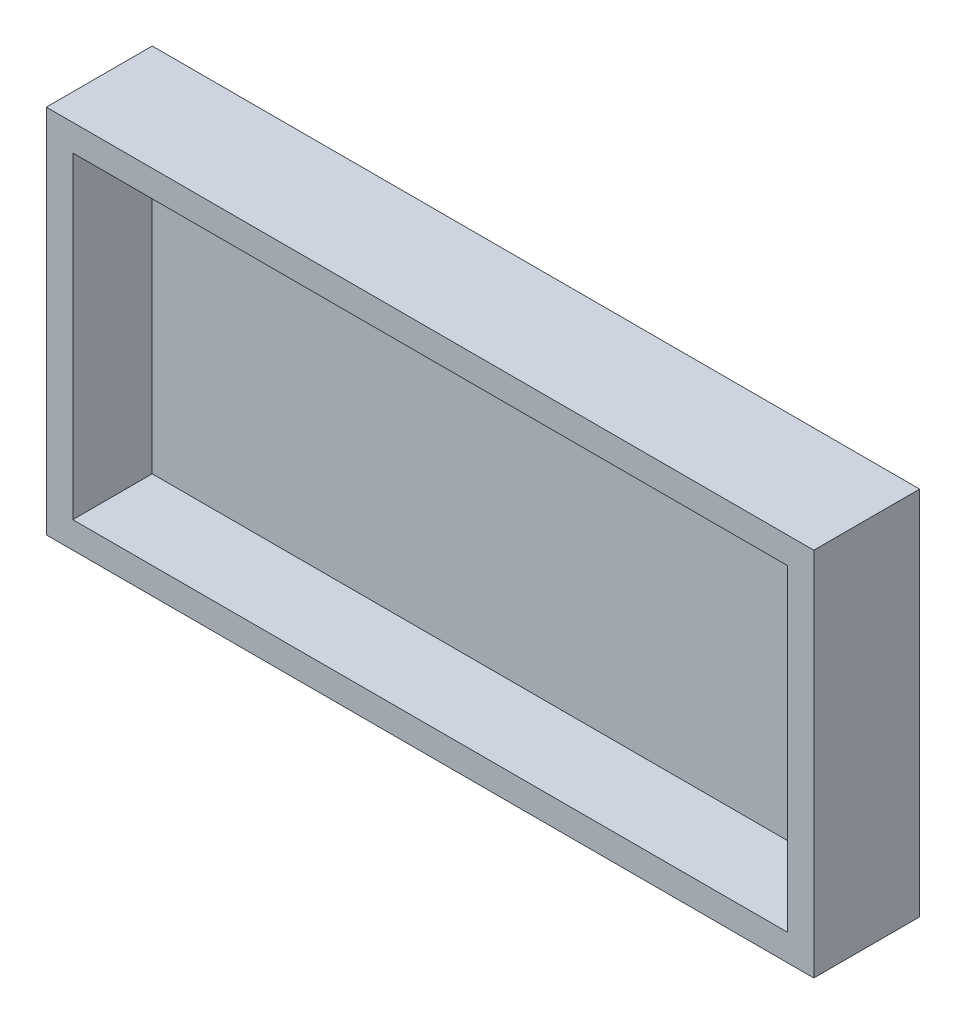
ISO-10303-21;
HEADER;
FILE_DESCRIPTION(('STEP AP214'),'2;1');
FILE_NAME('part.step','',(''),(''),'','','');
FILE_SCHEMA(('AUTOMOTIVE_DESIGN { 1 0 10303 214 1 1 1 1 }'));
ENDSEC;
DATA;
#1=APPLICATION_CONTEXT('core data for automotive mechanical design processes');
#2=APPLICATION_PROTOCOL_DEFINITION('international standard','automotive_design',2000,#1);
#3=PRODUCT_CONTEXT('',#1,'mechanical');
#4=PRODUCT('Part','Part','',(#3));
#5=PRODUCT_RELATED_PRODUCT_CATEGORY('part','',(#4));
#6=PRODUCT_DEFINITION_FORMATION('','',#4);
#7=PRODUCT_DEFINITION_CONTEXT('part definition',#1,'design');
#8=PRODUCT_DEFINITION('design','',#6,#7);
#9=PRODUCT_DEFINITION_SHAPE('','',#8);
#10=(LENGTH_UNIT() NAMED_UNIT(*) SI_UNIT(.MILLI.,.METRE.));
#11=(NAMED_UNIT(*) PLANE_ANGLE_UNIT() SI_UNIT($,.RADIAN.));
#12=(NAMED_UNIT(*) SI_UNIT($,.STERADIAN.) SOLID_ANGLE_UNIT());
#13=UNCERTAINTY_MEASURE_WITH_UNIT(LENGTH_MEASURE(1.E-05),#10,'distance_accuracy_value','');
#14=(GEOMETRIC_REPRESENTATION_CONTEXT(3) GLOBAL_UNCERTAINTY_ASSIGNED_CONTEXT((#13)) GLOBAL_UNIT_ASSIGNED_CONTEXT((#10,
#11,#12)) REPRESENTATION_CONTEXT('',''));
#15=CARTESIAN_POINT('',(0.,0.,0.));
#16=DIRECTION('',(0.,0.,1.));
#17=DIRECTION('',(1.,0.,0.));
#18=AXIS2_PLACEMENT_3D('',#15,#16,#17);
#19=CARTESIAN_POINT('',(29.,14.,2.));
#20=DIRECTION('',(-1.,0.,0.));
#21=DIRECTION('',(0.,-1.,0.));
#22=AXIS2_PLACEMENT_3D('',#19,#20,#21);
#23=PLANE('',#22);
#24=DIRECTION('',(0.,1.,0.));
#25=VECTOR('',#24,1.);
#26=CARTESIAN_POINT('',(29.,14.,0.));
#27=LINE('',#26,#25);
#28=CARTESIAN_POINT('',(29.,-14.,0.));
#29=VERTEX_POINT('',#28);
#30=CARTESIAN_POINT('',(29.,14.,0.));
#31=VERTEX_POINT('',#30);
#32=EDGE_CURVE('E144',#29,#31,#27,.T.);
#33=ORIENTED_EDGE('',*,*,#32,.T.);
#34=DIRECTION('',(0.,0.,-1.));
#35=VECTOR('',#34,1.);
#36=CARTESIAN_POINT('',(29.,14.,2.));
#37=LINE('',#36,#35);
#38=CARTESIAN_POINT('',(29.,14.,8.));
#39=VERTEX_POINT('',#38);
#40=EDGE_CURVE('E11',#39,#31,#37,.T.);
#41=ORIENTED_EDGE('',*,*,#40,.F.);
#42=DIRECTION('',(0.,1.,0.));
#43=VECTOR('',#42,1.);
#44=CARTESIAN_POINT('',(29.,14.,8.));
#45=LINE('',#44,#43);
#46=CARTESIAN_POINT('',(29.,-14.,8.));
#47=VERTEX_POINT('',#46);
#48=EDGE_CURVE('E111',#47,#39,#45,.T.);
#49=ORIENTED_EDGE('',*,*,#48,.F.);
#50=DIRECTION('',(0.,0.,-1.));
#51=VECTOR('',#50,1.);
#52=CARTESIAN_POINT('',(29.,-14.,2.));
#53=LINE('',#52,#51);
#54=EDGE_CURVE('E153',#47,#29,#53,.T.);
#55=ORIENTED_EDGE('',*,*,#54,.T.);
#56=EDGE_LOOP('',(#33,#41,#49,#55));
#57=FACE_BOUND('',#56,.T.);
#58=ADVANCED_FACE('F33',(#57),#23,.F.);
#59=CARTESIAN_POINT('',(-29.,14.,2.));
#60=DIRECTION('',(0.,-1.,0.));
#61=DIRECTION('',(0.,0.,-1.));
#62=AXIS2_PLACEMENT_3D('',#59,#60,#61);
#63=PLANE('',#62);
#64=DIRECTION('',(-1.,0.,0.));
#65=VECTOR('',#64,1.);
#66=CARTESIAN_POINT('',(-29.,14.,0.));
#67=LINE('',#66,#65);
#68=CARTESIAN_POINT('',(-29.,14.,0.));
#69=VERTEX_POINT('',#68);
#70=EDGE_CURVE('E147',#31,#69,#67,.T.);
#71=ORIENTED_EDGE('',*,*,#70,.T.);
#72=DIRECTION('',(0.,0.,-1.));
#73=VECTOR('',#72,1.);
#74=CARTESIAN_POINT('',(-29.,14.,2.));
#75=LINE('',#74,#73);
#76=CARTESIAN_POINT('',(-29.,14.,8.));
#77=VERTEX_POINT('',#76);
#78=EDGE_CURVE('E40',#77,#69,#75,.T.);
#79=ORIENTED_EDGE('',*,*,#78,.F.);
#80=DIRECTION('',(-1.,0.,0.));
#81=VECTOR('',#80,1.);
#82=CARTESIAN_POINT('',(-29.,14.,8.));
#83=LINE('',#82,#81);
#84=EDGE_CURVE('E135',#39,#77,#83,.T.);
#85=ORIENTED_EDGE('',*,*,#84,.F.);
#86=ORIENTED_EDGE('',*,*,#40,.T.);
#87=EDGE_LOOP('',(#71,#79,#85,#86));
#88=FACE_BOUND('',#87,.T.);
#89=ADVANCED_FACE('F175',(#88),#63,.F.);
#90=CARTESIAN_POINT('',(-29.,14.,2.));
#91=DIRECTION('',(1.,0.,0.));
#92=DIRECTION('',(0.,1.,0.));
#93=AXIS2_PLACEMENT_3D('',#90,#91,#92);
#94=PLANE('',#93);
#95=DIRECTION('',(0.,-1.,0.));
#96=VECTOR('',#95,1.);
#97=CARTESIAN_POINT('',(-29.,14.,0.));
#98=LINE('',#97,#96);
#99=CARTESIAN_POINT('',(-29.,-14.,0.));
#100=VERTEX_POINT('',#99);
#101=EDGE_CURVE('E149',#69,#100,#98,.T.);
#102=ORIENTED_EDGE('',*,*,#101,.T.);
#103=DIRECTION('',(0.,0.,-1.));
#104=VECTOR('',#103,1.);
#105=CARTESIAN_POINT('',(-29.,-14.,2.));
#106=LINE('',#105,#104);
#107=CARTESIAN_POINT('',(-29.,-14.,8.));
#108=VERTEX_POINT('',#107);
#109=EDGE_CURVE('E156',#108,#100,#106,.T.);
#110=ORIENTED_EDGE('',*,*,#109,.F.);
#111=DIRECTION('',(0.,-1.,0.));
#112=VECTOR('',#111,1.);
#113=CARTESIAN_POINT('',(-29.,14.,8.));
#114=LINE('',#113,#112);
#115=EDGE_CURVE('E138',#77,#108,#114,.T.);
#116=ORIENTED_EDGE('',*,*,#115,.F.);
#117=ORIENTED_EDGE('',*,*,#78,.T.);
#118=EDGE_LOOP('',(#102,#110,#116,#117));
#119=FACE_BOUND('',#118,.T.);
#120=ADVANCED_FACE('F162',(#119),#94,.F.);
#121=CARTESIAN_POINT('',(-29.,-14.,2.));
#122=DIRECTION('',(0.,1.,0.));
#123=DIRECTION('',(0.,0.,1.));
#124=AXIS2_PLACEMENT_3D('',#121,#122,#123);
#125=PLANE('',#124);
#126=DIRECTION('',(1.,0.,0.));
#127=VECTOR('',#126,1.);
#128=CARTESIAN_POINT('',(-29.,-14.,0.));
#129=LINE('',#128,#127);
#130=EDGE_CURVE('E151',#100,#29,#129,.T.);
#131=ORIENTED_EDGE('',*,*,#130,.T.);
#132=ORIENTED_EDGE('',*,*,#54,.F.);
#133=DIRECTION('',(1.,0.,0.));
#134=VECTOR('',#133,1.);
#135=CARTESIAN_POINT('',(-29.,-14.,8.));
#136=LINE('',#135,#134);
#137=EDGE_CURVE('E141',#108,#47,#136,.T.);
#138=ORIENTED_EDGE('',*,*,#137,.F.);
#139=ORIENTED_EDGE('',*,*,#109,.T.);
#140=EDGE_LOOP('',(#131,#132,#138,#139));
#141=FACE_BOUND('',#140,.T.);
#142=ADVANCED_FACE('F170',(#141),#125,.F.);
#143=CARTESIAN_POINT('',(0.,0.,0.));
#144=DIRECTION('',(0.,0.,1.));
#145=DIRECTION('',(1.,0.,0.));
#146=AXIS2_PLACEMENT_3D('',#143,#144,#145);
#147=PLANE('',#146);
#148=ORIENTED_EDGE('',*,*,#32,.F.);
#149=ORIENTED_EDGE('',*,*,#130,.F.);
#150=ORIENTED_EDGE('',*,*,#101,.F.);
#151=ORIENTED_EDGE('',*,*,#70,.F.);
#152=EDGE_LOOP('',(#148,#149,#150,#151));
#153=FACE_BOUND('',#152,.T.);
#154=ADVANCED_FACE('F168',(#153),#147,.F.);
#155=CARTESIAN_POINT('',(0.,0.,8.));
#156=DIRECTION('',(0.,0.,1.));
#157=DIRECTION('',(1.,0.,0.));
#158=AXIS2_PLACEMENT_3D('',#155,#156,#157);
#159=PLANE('',#158);
#160=ORIENTED_EDGE('',*,*,#48,.T.);
#161=ORIENTED_EDGE('',*,*,#84,.T.);
#162=ORIENTED_EDGE('',*,*,#115,.T.);
#163=ORIENTED_EDGE('',*,*,#137,.T.);
#164=EDGE_LOOP('',(#160,#161,#162,#163));
#165=FACE_BOUND('',#164,.T.);
#166=DIRECTION('',(-1.,0.,0.));
#167=VECTOR('',#166,1.);
#168=CARTESIAN_POINT('',(-27.,12.,8.));
#169=LINE('',#168,#167);
#170=CARTESIAN_POINT('',(27.,12.,8.));
#171=VERTEX_POINT('',#170);
#172=CARTESIAN_POINT('',(-27.,12.,8.));
#173=VERTEX_POINT('',#172);
#174=EDGE_CURVE('E105',#171,#173,#169,.T.);
#175=ORIENTED_EDGE('',*,*,#174,.F.);
#176=DIRECTION('',(0.,1.,0.));
#177=VECTOR('',#176,1.);
#178=CARTESIAN_POINT('',(27.,12.,8.));
#179=LINE('',#178,#177);
#180=CARTESIAN_POINT('',(27.,-12.,8.));
#181=VERTEX_POINT('',#180);
#182=EDGE_CURVE('E96',#181,#171,#179,.T.);
#183=ORIENTED_EDGE('',*,*,#182,.F.);
#184=DIRECTION('',(1.,0.,0.));
#185=VECTOR('',#184,1.);
#186=CARTESIAN_POINT('',(-27.,-12.,8.));
#187=LINE('',#186,#185);
#188=CARTESIAN_POINT('',(-27.,-12.,8.));
#189=VERTEX_POINT('',#188);
#190=EDGE_CURVE('E119',#189,#181,#187,.T.);
#191=ORIENTED_EDGE('',*,*,#190,.F.);
#192=DIRECTION('',(0.,-1.,0.));
#193=VECTOR('',#192,1.);
#194=CARTESIAN_POINT('',(-27.,12.,8.));
#195=LINE('',#194,#193);
#196=EDGE_CURVE('E117',#173,#189,#195,.T.);
#197=ORIENTED_EDGE('',*,*,#196,.F.);
#198=EDGE_LOOP('',(#175,#183,#191,#197));
#199=FACE_BOUND('',#198,.T.);
#200=ADVANCED_FACE('F115',(#165,#199),#159,.T.);
#201=CARTESIAN_POINT('',(27.,12.,8.));
#202=DIRECTION('',(-1.,0.,0.));
#203=DIRECTION('',(0.,0.,1.));
#204=AXIS2_PLACEMENT_3D('',#201,#202,#203);
#205=PLANE('',#204);
#206=DIRECTION('',(0.,1.,0.));
#207=VECTOR('',#206,1.);
#208=CARTESIAN_POINT('',(27.,12.,2.));
#209=LINE('',#208,#207);
#210=CARTESIAN_POINT('',(27.,-12.,2.));
#211=VERTEX_POINT('',#210);
#212=CARTESIAN_POINT('',(27.,12.,2.));
#213=VERTEX_POINT('',#212);
#214=EDGE_CURVE('E47',#211,#213,#209,.T.);
#215=ORIENTED_EDGE('',*,*,#214,.F.);
#216=DIRECTION('',(0.,0.,-1.));
#217=VECTOR('',#216,1.);
#218=CARTESIAN_POINT('',(27.,-12.,8.));
#219=LINE('',#218,#217);
#220=EDGE_CURVE('E101',#181,#211,#219,.T.);
#221=ORIENTED_EDGE('',*,*,#220,.F.);
#222=ORIENTED_EDGE('',*,*,#182,.T.);
#223=DIRECTION('',(0.,0.,-1.));
#224=VECTOR('',#223,1.);
#225=CARTESIAN_POINT('',(27.,12.,8.));
#226=LINE('',#225,#224);
#227=EDGE_CURVE('E99',#171,#213,#226,.T.);
#228=ORIENTED_EDGE('',*,*,#227,.T.);
#229=EDGE_LOOP('',(#215,#221,#222,#228));
#230=FACE_BOUND('',#229,.T.);
#231=ADVANCED_FACE('F98',(#230),#205,.T.);
#232=CARTESIAN_POINT('',(-27.,12.,8.));
#233=DIRECTION('',(0.,-1.,0.));
#234=DIRECTION('',(0.,0.,-1.));
#235=AXIS2_PLACEMENT_3D('',#232,#233,#234);
#236=PLANE('',#235);
#237=DIRECTION('',(-1.,0.,0.));
#238=VECTOR('',#237,1.);
#239=CARTESIAN_POINT('',(-27.,12.,2.));
#240=LINE('',#239,#238);
#241=CARTESIAN_POINT('',(-27.,12.,2.));
#242=VERTEX_POINT('',#241);
#243=EDGE_CURVE('E51',#213,#242,#240,.T.);
#244=ORIENTED_EDGE('',*,*,#243,.F.);
#245=ORIENTED_EDGE('',*,*,#227,.F.);
#246=ORIENTED_EDGE('',*,*,#174,.T.);
#247=DIRECTION('',(0.,0.,-1.));
#248=VECTOR('',#247,1.);
#249=CARTESIAN_POINT('',(-27.,12.,8.));
#250=LINE('',#249,#248);
#251=EDGE_CURVE('E112',#173,#242,#250,.T.);
#252=ORIENTED_EDGE('',*,*,#251,.T.);
#253=EDGE_LOOP('',(#244,#245,#246,#252));
#254=FACE_BOUND('',#253,.T.);
#255=ADVANCED_FACE('F109',(#254),#236,.T.);
#256=CARTESIAN_POINT('',(-27.,12.,8.));
#257=DIRECTION('',(1.,0.,0.));
#258=DIRECTION('',(0.,0.,-1.));
#259=AXIS2_PLACEMENT_3D('',#256,#257,#258);
#260=PLANE('',#259);
#261=DIRECTION('',(0.,-1.,0.));
#262=VECTOR('',#261,1.);
#263=CARTESIAN_POINT('',(-27.,12.,2.));
#264=LINE('',#263,#262);
#265=CARTESIAN_POINT('',(-27.,-12.,2.));
#266=VERTEX_POINT('',#265);
#267=EDGE_CURVE('E125',#242,#266,#264,.T.);
#268=ORIENTED_EDGE('',*,*,#267,.F.);
#269=ORIENTED_EDGE('',*,*,#251,.F.);
#270=ORIENTED_EDGE('',*,*,#196,.T.);
#271=DIRECTION('',(0.,0.,-1.));
#272=VECTOR('',#271,1.);
#273=CARTESIAN_POINT('',(-27.,-12.,8.));
#274=LINE('',#273,#272);
#275=EDGE_CURVE('E129',#189,#266,#274,.T.);
#276=ORIENTED_EDGE('',*,*,#275,.T.);
#277=EDGE_LOOP('',(#268,#269,#270,#276));
#278=FACE_BOUND('',#277,.T.);
#279=ADVANCED_FACE('F197',(#278),#260,.T.);
#280=CARTESIAN_POINT('',(-27.,-12.,8.));
#281=DIRECTION('',(0.,1.,0.));
#282=DIRECTION('',(0.,0.,1.));
#283=AXIS2_PLACEMENT_3D('',#280,#281,#282);
#284=PLANE('',#283);
#285=DIRECTION('',(1.,0.,0.));
#286=VECTOR('',#285,1.);
#287=CARTESIAN_POINT('',(-27.,-12.,2.));
#288=LINE('',#287,#286);
#289=EDGE_CURVE('E106',#266,#211,#288,.T.);
#290=ORIENTED_EDGE('',*,*,#289,.F.);
#291=ORIENTED_EDGE('',*,*,#275,.F.);
#292=ORIENTED_EDGE('',*,*,#190,.T.);
#293=ORIENTED_EDGE('',*,*,#220,.T.);
#294=EDGE_LOOP('',(#290,#291,#292,#293));
#295=FACE_BOUND('',#294,.T.);
#296=ADVANCED_FACE('F190',(#295),#284,.T.);
#297=CARTESIAN_POINT('',(0.,0.,2.));
#298=DIRECTION('',(0.,0.,1.));
#299=DIRECTION('',(1.,0.,0.));
#300=AXIS2_PLACEMENT_3D('',#297,#298,#299);
#301=PLANE('',#300);
#302=ORIENTED_EDGE('',*,*,#214,.T.);
#303=ORIENTED_EDGE('',*,*,#243,.T.);
#304=ORIENTED_EDGE('',*,*,#267,.T.);
#305=ORIENTED_EDGE('',*,*,#289,.T.);
#306=EDGE_LOOP('',(#302,#303,#304,#305));
#307=FACE_BOUND('',#306,.T.);
#308=ADVANCED_FACE('F187',(#307),#301,.T.);
#309=CLOSED_SHELL('',(#58,#89,#120,#142,#154,#200,#231,#255,#279,#296,#308));
#310=MANIFOLD_SOLID_BREP('B2',#309);
#311=ADVANCED_BREP_SHAPE_REPRESENTATION('',(#18,#310),#14);
#312=SHAPE_DEFINITION_REPRESENTATION(#9,#311);
ENDSEC;
END-ISO-10303-21;
